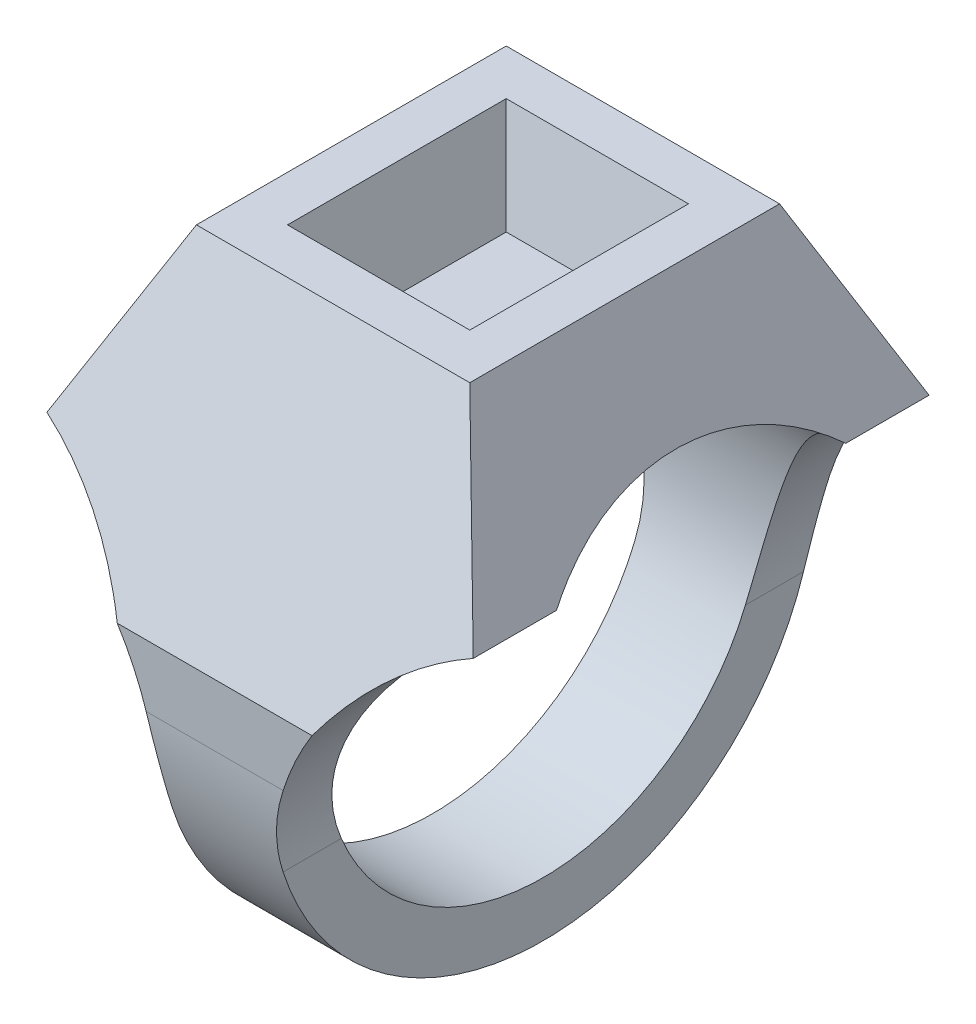
ISO-10303-21;
HEADER;
FILE_DESCRIPTION(('STEP AP214'),'2;1');
FILE_NAME('part.step','',(''),(''),'','','');
FILE_SCHEMA(('AUTOMOTIVE_DESIGN { 1 0 10303 214 1 1 1 1 }'));
ENDSEC;
DATA;
#1=APPLICATION_CONTEXT('core data for automotive mechanical design processes');
#2=APPLICATION_PROTOCOL_DEFINITION('international standard','automotive_design',2000,#1);
#3=PRODUCT_CONTEXT('',#1,'mechanical');
#4=PRODUCT('Part','Part','',(#3));
#5=PRODUCT_RELATED_PRODUCT_CATEGORY('part','',(#4));
#6=PRODUCT_DEFINITION_FORMATION('','',#4);
#7=PRODUCT_DEFINITION_CONTEXT('part definition',#1,'design');
#8=PRODUCT_DEFINITION('design','',#6,#7);
#9=PRODUCT_DEFINITION_SHAPE('','',#8);
#10=(LENGTH_UNIT() NAMED_UNIT(*) SI_UNIT(.MILLI.,.METRE.));
#11=(NAMED_UNIT(*) PLANE_ANGLE_UNIT() SI_UNIT($,.RADIAN.));
#12=(NAMED_UNIT(*) SI_UNIT($,.STERADIAN.) SOLID_ANGLE_UNIT());
#13=UNCERTAINTY_MEASURE_WITH_UNIT(LENGTH_MEASURE(1.E-05),#10,'distance_accuracy_value','');
#14=(GEOMETRIC_REPRESENTATION_CONTEXT(3) GLOBAL_UNCERTAINTY_ASSIGNED_CONTEXT((#13)) GLOBAL_UNIT_ASSIGNED_CONTEXT((#10,
#11,#12)) REPRESENTATION_CONTEXT('',''));
#15=CARTESIAN_POINT('',(0.,0.,0.));
#16=DIRECTION('',(0.,0.,1.));
#17=DIRECTION('',(1.,0.,0.));
#18=AXIS2_PLACEMENT_3D('',#15,#16,#17);
#19=CARTESIAN_POINT('',(25.,0.,0.));
#20=DIRECTION('',(-1.,0.,0.));
#21=DIRECTION('',(0.,0.,1.));
#22=AXIS2_PLACEMENT_3D('',#19,#20,#21);
#23=CYLINDRICAL_SURFACE('',#22,12.);
#24=CARTESIAN_POINT('',(11.696768923395,9.00000000000001,7.93725393319377));
#25=CARTESIAN_POINT('',(11.4898922507499,8.90351609964056,8.04667349740066));
#26=CARTESIAN_POINT('',(11.2856632608987,8.80254830553338,8.15712207840189));
#27=CARTESIAN_POINT('',(10.8824078082062,8.59164106073572,8.37896501460795));
#28=CARTESIAN_POINT('',(10.683381489789,8.48170136133743,8.49035939595431));
#29=CARTESIAN_POINT('',(10.2901048566922,8.25265076780511,8.71317102583135));
#30=CARTESIAN_POINT('',(10.0958635466891,8.13352410114215,8.82458797073825));
#31=CARTESIAN_POINT('',(9.71256268223377,7.88623633042385,9.04626191735328));
#32=CARTESIAN_POINT('',(9.52350308689503,7.75807529768293,9.15651892820967));
#33=CARTESIAN_POINT('',(8.9601721737352,7.35706413653597,9.48653155989749));
#34=CARTESIAN_POINT('',(8.5939280432559,7.07011290633731,9.70312298997915));
#35=CARTESIAN_POINT('',(7.8849565777725,6.45863032678025,10.1204263028944));
#36=CARTESIAN_POINT('',(7.54220931293983,6.1341314690592,10.3211516658616));
#37=CARTESIAN_POINT('',(6.98814625535127,5.5566945729337,10.6392918166008));
#38=CARTESIAN_POINT('',(6.76975468591393,5.31390732928115,10.7628707384123));
#39=CARTESIAN_POINT('',(6.34647349150372,4.81080752831703,10.9969580536258));
#40=CARTESIAN_POINT('',(6.14158358476757,4.55049533695912,11.1074667198264));
#41=CARTESIAN_POINT('',(5.74765796408806,4.01386366385306,11.3124297164592));
#42=CARTESIAN_POINT('',(5.55856199547818,3.73761252408568,11.4069466200406));
#43=CARTESIAN_POINT('',(5.19706007980886,3.16901263696019,11.5777989496208));
#44=CARTESIAN_POINT('',(5.02465114122809,2.8766667897338,11.6541376380658));
#45=CARTESIAN_POINT('',(4.72562423173207,2.3273458547535,11.7749227916433));
#46=CARTESIAN_POINT('',(4.5961673635325,2.0726164573523,11.8225661840739));
#47=CARTESIAN_POINT('',(4.35119713386637,1.55413603286753,11.9018235106766));
#48=CARTESIAN_POINT('',(4.23568105507132,1.29038677683287,11.9334405725468));
#49=CARTESIAN_POINT('',(4.01951236535601,0.755169507030311,11.9792276078791));
#50=CARTESIAN_POINT('',(3.91886902299318,0.483696804681932,11.9933867417354));
#51=CARTESIAN_POINT('',(3.73339102333747,-0.064938436597976,12.002959676648));
#52=CARTESIAN_POINT('',(3.64855592366956,-0.342100816069565,11.9983740023382));
#53=CARTESIAN_POINT('',(3.49491881390242,-0.901349641031113,11.9693925370385));
#54=CARTESIAN_POINT('',(3.42620037475787,-1.18345393992003,11.9448963067047));
#55=CARTESIAN_POINT('',(3.30563953723561,-1.74878541220327,11.8753046240213));
#56=CARTESIAN_POINT('',(3.25379973790869,-2.03201275173858,11.8302060017873));
#57=CARTESIAN_POINT('',(3.16698356966412,-2.5964899279227,11.7192518071775));
#58=CARTESIAN_POINT('',(3.1319805745176,-2.87774218918747,11.6534292828156));
#59=CARTESIAN_POINT('',(3.0782259930045,-3.43604801080039,11.5011826421243));
#60=CARTESIAN_POINT('',(3.05946421607349,-3.7131040966517,11.4147714876195));
#61=CARTESIAN_POINT('',(3.04420929684909,-4.08919489553572,11.282299877384));
#62=CARTESIAN_POINT('',(3.04112833424835,-4.19109177333682,11.2448453885665));
#63=CARTESIAN_POINT('',(3.03704686969024,-4.3937137718804,11.1672297899866));
#64=CARTESIAN_POINT('',(3.03604320696529,-4.49444044059509,11.12707288843));
#65=CARTESIAN_POINT('',(3.03604284950542,-4.59461680554976,11.0855535003968));
#66=B_SPLINE_CURVE_WITH_KNOTS('',3,(#24,#25,#26,#27,#28,#29,#30,#31,#32,#33,#34,#35,#36,#37,#38,
#39,#40,#41,#42,#43,#44,#45,#46,#47,#48,#49,#50,#51,#52,#53,#54,#55,#56,#57,#58,#59,#60,#61,#62,
#63,#64,#65),.UNSPECIFIED.,.F.,.F.,(4,2,2,2,2,2,2,2,2,2,2,2,2,2,2,2,2,2,2,2,4),(0.,
0.759348586630302,1.51871823011696,2.27942192433916,3.04011961448058,4.57765959936899,
6.11387889479053,7.16052804714838,8.20715535029017,9.24958759251021,10.2918326080692,
11.1600331862337,12.028064261107,12.8966340244342,13.7651794782093,14.638133727822,
15.5112223354521,16.3829256376171,17.2540815916275,17.5798547939013,17.9051319423045),.UNSPECIFIED.);
#67=CARTESIAN_POINT('',(11.696768923395,9.00000000000001,7.93725393319376));
#68=VERTEX_POINT('',#67);
#69=CARTESIAN_POINT('',(3.03604284950542,-4.59461680554976,11.0855535003968));
#70=VERTEX_POINT('',#69);
#71=EDGE_CURVE('E313',#68,#70,#66,.T.);
#72=ORIENTED_EDGE('',*,*,#71,.T.);
#73=CARTESIAN_POINT('',(3.03604284950542,0.,0.));
#74=DIRECTION('',(1.,0.,0.));
#75=DIRECTION('',(0.,0.,-1.));
#76=AXIS2_PLACEMENT_3D('',#73,#74,#75);
#77=CIRCLE('',#76,12.);
#78=CARTESIAN_POINT('',(3.03604284950542,-4.59461680554976,-11.0855535003968));
#79=VERTEX_POINT('',#78);
#80=EDGE_CURVE('E329',#70,#79,#77,.T.);
#81=ORIENTED_EDGE('',*,*,#80,.T.);
#82=CARTESIAN_POINT('',(3.03604284950542,-4.59461680554976,-11.0855535003968));
#83=CARTESIAN_POINT('',(3.036041789301,-4.46706348438094,-11.138421419146));
#84=CARTESIAN_POINT('',(3.03767035833519,-4.33861036349681,-11.1890798636254));
#85=CARTESIAN_POINT('',(3.0443118772741,-4.08010767040448,-11.2859103847761));
#86=CARTESIAN_POINT('',(3.04932490540121,-3.95005806136609,-11.3320823577269));
#87=CARTESIAN_POINT('',(3.06962580801962,-3.55787556145178,-11.4637480042315));
#88=CARTESIAN_POINT('',(3.0901754098747,-3.29366259483693,-11.542410625838));
#89=CARTESIAN_POINT('',(3.14590641440269,-2.76302033783825,-11.6807802152518));
#90=CARTESIAN_POINT('',(3.1810284158462,-2.49660430006689,-11.7405624222479));
#91=CARTESIAN_POINT('',(3.26627957514473,-1.96266675756447,-11.8415261544587));
#92=CARTESIAN_POINT('',(3.31640740910512,-1.69514535240735,-11.8827093197763));
#93=CARTESIAN_POINT('',(3.43178461738038,-1.16090106994587,-11.9467472187745));
#94=CARTESIAN_POINT('',(3.49704893360426,-0.894179247213834,-11.9695837415583));
#95=CARTESIAN_POINT('',(3.6424216924295,-0.363863719348178,-11.9974212423297));
#96=CARTESIAN_POINT('',(3.72253115589915,-0.100270230670516,-12.0024209932422));
#97=CARTESIAN_POINT('',(3.89708511165548,0.421924236239038,-11.9954234663236));
#98=CARTESIAN_POINT('',(3.99153197231492,0.68052438165809,-11.9834233775811));
#99=CARTESIAN_POINT('',(4.19402826172605,1.19106012761191,-11.9434897418651));
#100=CARTESIAN_POINT('',(4.30207785517391,1.44299564740949,-11.9155560019593));
#101=CARTESIAN_POINT('',(4.53316925707393,1.94372608059834,-11.8442870165842));
#102=CARTESIAN_POINT('',(4.65646342508172,2.19236262977887,-11.8006606054012));
#103=CARTESIAN_POINT('',(4.91532559810576,2.68020578067013,-11.6995112468579));
#104=CARTESIAN_POINT('',(5.0508935485062,2.91941242433522,-11.6419883613321));
#105=CARTESIAN_POINT('',(5.33340846483162,3.38773319804166,-11.5144343788272));
#106=CARTESIAN_POINT('',(5.4803622589175,3.61684114059431,-11.4443957426687));
#107=CARTESIAN_POINT('',(5.78464694060675,4.06428255226334,-11.2932457098966));
#108=CARTESIAN_POINT('',(5.94198005696048,4.28261368956694,-11.2121319310931));
#109=CARTESIAN_POINT('',(6.35294688322988,4.82206411246525,-10.9941715341438));
#110=CARTESIAN_POINT('',(6.61304417740289,5.13563863381522,-10.8507352285186));
#111=CARTESIAN_POINT('',(7.15291708165342,5.73595556999455,-10.545723346538));
#112=CARTESIAN_POINT('',(7.43270243804255,6.0226845292694,-10.3841387621902));
#113=CARTESIAN_POINT('',(8.01023109341833,6.56968146369542,-10.0470217260895));
#114=CARTESIAN_POINT('',(8.30800462923527,6.82990279194785,-9.87146562264844));
#115=CARTESIAN_POINT('',(8.91942184260403,7.32350309212359,-9.5110291057263));
#116=CARTESIAN_POINT('',(9.23306034645477,7.55689073451035,-9.32615173205412));
#117=CARTESIAN_POINT('',(9.89536247139068,8.01095289546064,-8.93973325502395));
#118=CARTESIAN_POINT('',(10.2449924640223,8.22994684789052,-8.73786895108222));
#119=CARTESIAN_POINT('',(10.7810470594009,8.53576963673854,-8.43570141780814));
#120=CARTESIAN_POINT('',(10.9611895305723,8.63370985870978,-8.33534063649873));
#121=CARTESIAN_POINT('',(11.3257512458851,8.82231463455356,-8.13545803656732));
#122=CARTESIAN_POINT('',(11.5101712874384,8.91297781758099,-8.03593637916445));
#123=CARTESIAN_POINT('',(11.696768923395,9.00000000000001,-7.93725393319377));
#124=B_SPLINE_CURVE_WITH_KNOTS('',3,(#82,#83,#84,#85,#86,#87,#88,#89,#90,#91,#92,#93,#94,#95,
#96,#97,#98,#99,#100,#101,#102,#103,#104,#105,#106,#107,#108,#109,#110,#111,#112,#113,#114,#115,
#116,#117,#118,#119,#120,#121,#122,#123),.UNSPECIFIED.,.F.,.F.,(4,2,2,2,2,2,2,2,2,2,2,2,2,2,2,2,
2,2,2,2,4),(0.,0.414165407508414,0.828340387630296,1.65654016329892,2.48139662267758,
3.3061803302539,4.13178171100707,4.95743988764457,5.78323460221001,6.60903931611264,
7.45103137420718,8.29301968579328,9.13551691064011,9.97819563737871,11.2719945577453,
12.5664385238796,13.8631224082928,15.1593861254669,16.5358690414418,17.2206028657483,
17.9054653786171),.UNSPECIFIED.);
#125=CARTESIAN_POINT('',(11.696768923395,9.00000000000001,-7.93725393319377));
#126=VERTEX_POINT('',#125);
#127=EDGE_CURVE('E321',#79,#126,#124,.T.);
#128=ORIENTED_EDGE('',*,*,#127,.T.);
#129=CARTESIAN_POINT('',(15.8935378467899,0.,0.));
#130=DIRECTION('',(0.906307787036651,0.422618261740698,0.));
#131=DIRECTION('',(-0.422618261740698,0.906307787036651,0.));
#132=AXIS2_PLACEMENT_3D('',#129,#130,#131);
#133=ELLIPSE('',#132,13.2405350275499,12.);
#134=EDGE_CURVE('E401',#126,#68,#133,.T.);
#135=ORIENTED_EDGE('',*,*,#134,.T.);
#136=EDGE_LOOP('',(#72,#81,#128,#135));
#137=FACE_BOUND('',#136,.T.);
#138=CARTESIAN_POINT('',(-11.696768923395,9.00000000000001,-7.93725393319377));
#139=CARTESIAN_POINT('',(-11.4898922507499,8.90351609964057,-8.04667349740066));
#140=CARTESIAN_POINT('',(-11.2856632608987,8.80254830553338,-8.15712207840189));
#141=CARTESIAN_POINT('',(-10.8824078082062,8.59164106073572,-8.37896501460795));
#142=CARTESIAN_POINT('',(-10.683381489789,8.48170136133743,-8.49035939595431));
#143=CARTESIAN_POINT('',(-10.2901048566922,8.25265076780511,-8.71317102583135));
#144=CARTESIAN_POINT('',(-10.0958635466891,8.13352410114215,-8.82458797073825));
#145=CARTESIAN_POINT('',(-9.71256268223377,7.88623633042386,-9.04626191735328));
#146=CARTESIAN_POINT('',(-9.52350308689504,7.75807529768294,-9.15651892820967));
#147=CARTESIAN_POINT('',(-8.9601721737352,7.35706413653597,-9.48653155989749));
#148=CARTESIAN_POINT('',(-8.5939280432559,7.07011290633732,-9.70312298997915));
#149=CARTESIAN_POINT('',(-7.8849565777725,6.45863032678025,-10.1204263028944));
#150=CARTESIAN_POINT('',(-7.54220931293983,6.1341314690592,-10.3211516658616));
#151=CARTESIAN_POINT('',(-6.98814625535127,5.5566945729337,-10.6392918166008));
#152=CARTESIAN_POINT('',(-6.76975468591393,5.31390732928115,-10.7628707384123));
#153=CARTESIAN_POINT('',(-6.34647349150372,4.81080752831703,-10.9969580536258));
#154=CARTESIAN_POINT('',(-6.14158358476757,4.55049533695912,-11.1074667198264));
#155=CARTESIAN_POINT('',(-5.74765796408806,4.01386366385306,-11.3124297164592));
#156=CARTESIAN_POINT('',(-5.55856199547818,3.73761252408568,-11.4069466200406));
#157=CARTESIAN_POINT('',(-5.19706007980886,3.16901263696019,-11.5777989496208));
#158=CARTESIAN_POINT('',(-5.02465114122809,2.8766667897338,-11.6541376380658));
#159=CARTESIAN_POINT('',(-4.72562423173207,2.3273458547535,-11.7749227916433));
#160=CARTESIAN_POINT('',(-4.5961673635325,2.07261645735229,-11.8225661840739));
#161=CARTESIAN_POINT('',(-4.35119713386637,1.55413603286753,-11.9018235106766));
#162=CARTESIAN_POINT('',(-4.23568105507132,1.29038677683287,-11.9334405725468));
#163=CARTESIAN_POINT('',(-4.01951236535601,0.755169507030311,-11.9792276078791));
#164=CARTESIAN_POINT('',(-3.91886902299318,0.483696804681931,-11.9933867417354));
#165=CARTESIAN_POINT('',(-3.73339102333747,-0.0649384365979764,-12.002959676648));
#166=CARTESIAN_POINT('',(-3.64855592366956,-0.342100816069565,-11.9983740023382));
#167=CARTESIAN_POINT('',(-3.49491881390242,-0.901349641031113,-11.9693925370385));
#168=CARTESIAN_POINT('',(-3.42620037475787,-1.18345393992003,-11.9448963067047));
#169=CARTESIAN_POINT('',(-3.30563953723561,-1.74878541220327,-11.8753046240213));
#170=CARTESIAN_POINT('',(-3.25379973790868,-2.03201275173858,-11.8302060017873));
#171=CARTESIAN_POINT('',(-3.16698356966412,-2.5964899279227,-11.7192518071775));
#172=CARTESIAN_POINT('',(-3.1319805745176,-2.87774218918747,-11.6534292828156));
#173=CARTESIAN_POINT('',(-3.0782259930045,-3.43604801080039,-11.5011826421243));
#174=CARTESIAN_POINT('',(-3.05946421607348,-3.71310409665171,-11.4147714876195));
#175=CARTESIAN_POINT('',(-3.04420929684909,-4.08919489553573,-11.282299877384));
#176=CARTESIAN_POINT('',(-3.04112833424835,-4.19109177333682,-11.2448453885665));
#177=CARTESIAN_POINT('',(-3.03704686969024,-4.3937137718804,-11.1672297899866));
#178=CARTESIAN_POINT('',(-3.03604320696529,-4.49444044059509,-11.12707288843));
#179=CARTESIAN_POINT('',(-3.03604284950542,-4.59461680554976,-11.0855535003968));
#180=B_SPLINE_CURVE_WITH_KNOTS('',3,(#138,#139,#140,#141,#142,#143,#144,#145,#146,#147,#148,
#149,#150,#151,#152,#153,#154,#155,#156,#157,#158,#159,#160,#161,#162,#163,#164,#165,#166,#167,
#168,#169,#170,#171,#172,#173,#174,#175,#176,#177,#178,#179),.UNSPECIFIED.,.F.,.F.,(4,2,2,2,2,2,
2,2,2,2,2,2,2,2,2,2,2,2,2,2,4),(0.,0.759348586630302,1.51871823011696,2.27942192433916,
3.04011961448058,4.57765959936899,6.11387889479053,7.16052804714838,8.20715535029017,
9.24958759251021,10.2918326080692,11.1600331862338,12.028064261107,12.8966340244342,
13.7651794782093,14.638133727822,15.5112223354521,16.3829256376171,17.2540815916275,
17.5798547939013,17.9051319423045),.UNSPECIFIED.);
#181=CARTESIAN_POINT('',(-11.696768923395,9.00000000000001,-7.93725393319377));
#182=VERTEX_POINT('',#181);
#183=CARTESIAN_POINT('',(-3.03604284950542,-4.59461680554976,-11.0855535003968));
#184=VERTEX_POINT('',#183);
#185=EDGE_CURVE('E55',#182,#184,#180,.T.);
#186=ORIENTED_EDGE('',*,*,#185,.T.);
#187=CARTESIAN_POINT('',(-3.03604284950542,0.,0.));
#188=DIRECTION('',(-1.,0.,0.));
#189=DIRECTION('',(0.,0.,1.));
#190=AXIS2_PLACEMENT_3D('',#187,#188,#189);
#191=CIRCLE('',#190,12.);
#192=CARTESIAN_POINT('',(-3.03604284950542,-4.59461680554976,11.0855535003968));
#193=VERTEX_POINT('',#192);
#194=EDGE_CURVE('E12',#184,#193,#191,.T.);
#195=ORIENTED_EDGE('',*,*,#194,.T.);
#196=CARTESIAN_POINT('',(-3.03604284950542,-4.59461680554976,11.0855535003968));
#197=CARTESIAN_POINT('',(-3.036041789301,-4.46706348438094,11.138421419146));
#198=CARTESIAN_POINT('',(-3.03767035833519,-4.33861036349681,11.1890798636254));
#199=CARTESIAN_POINT('',(-3.0443118772741,-4.08010767040448,11.2859103847761));
#200=CARTESIAN_POINT('',(-3.04932490540121,-3.95005806136609,11.3320823577269));
#201=CARTESIAN_POINT('',(-3.06962580801962,-3.55787556145178,11.4637480042315));
#202=CARTESIAN_POINT('',(-3.0901754098747,-3.29366259483693,11.542410625838));
#203=CARTESIAN_POINT('',(-3.14590641440269,-2.76302033783825,11.6807802152518));
#204=CARTESIAN_POINT('',(-3.1810284158462,-2.49660430006689,11.7405624222479));
#205=CARTESIAN_POINT('',(-3.26627957514473,-1.96266675756447,11.8415261544587));
#206=CARTESIAN_POINT('',(-3.31640740910512,-1.69514535240735,11.8827093197763));
#207=CARTESIAN_POINT('',(-3.43178461738038,-1.16090106994587,11.9467472187745));
#208=CARTESIAN_POINT('',(-3.49704893360426,-0.894179247213834,11.9695837415583));
#209=CARTESIAN_POINT('',(-3.6424216924295,-0.363863719348178,11.9974212423297));
#210=CARTESIAN_POINT('',(-3.72253115589915,-0.100270230670516,12.0024209932422));
#211=CARTESIAN_POINT('',(-3.89708511165548,0.421924236239038,11.9954234663236));
#212=CARTESIAN_POINT('',(-3.99153197231492,0.68052438165809,11.9834233775811));
#213=CARTESIAN_POINT('',(-4.19402826172605,1.19106012761191,11.9434897418651));
#214=CARTESIAN_POINT('',(-4.30207785517391,1.44299564740949,11.9155560019593));
#215=CARTESIAN_POINT('',(-4.53316925707393,1.94372608059834,11.8442870165842));
#216=CARTESIAN_POINT('',(-4.65646342508172,2.19236262977887,11.8006606054012));
#217=CARTESIAN_POINT('',(-4.91532559810576,2.68020578067013,11.6995112468579));
#218=CARTESIAN_POINT('',(-5.0508935485062,2.91941242433522,11.6419883613321));
#219=CARTESIAN_POINT('',(-5.33340846483162,3.38773319804166,11.5144343788272));
#220=CARTESIAN_POINT('',(-5.4803622589175,3.61684114059431,11.4443957426687));
#221=CARTESIAN_POINT('',(-5.78464694060675,4.06428255226334,11.2932457098966));
#222=CARTESIAN_POINT('',(-5.94198005696048,4.28261368956694,11.2121319310931));
#223=CARTESIAN_POINT('',(-6.35294688322988,4.82206411246525,10.9941715341438));
#224=CARTESIAN_POINT('',(-6.61304417740289,5.13563863381522,10.8507352285186));
#225=CARTESIAN_POINT('',(-7.15291708165342,5.73595556999455,10.545723346538));
#226=CARTESIAN_POINT('',(-7.43270243804255,6.0226845292694,10.3841387621902));
#227=CARTESIAN_POINT('',(-8.01023109341833,6.56968146369542,10.0470217260895));
#228=CARTESIAN_POINT('',(-8.30800462923526,6.82990279194786,9.87146562264844));
#229=CARTESIAN_POINT('',(-8.91942184260403,7.3235030921236,9.5110291057263));
#230=CARTESIAN_POINT('',(-9.23306034645477,7.55689073451035,9.32615173205412));
#231=CARTESIAN_POINT('',(-9.89536247139068,8.01095289546064,8.93973325502395));
#232=CARTESIAN_POINT('',(-10.2449924640223,8.22994684789052,8.73786895108222));
#233=CARTESIAN_POINT('',(-10.7810470594009,8.53576963673854,8.43570141780814));
#234=CARTESIAN_POINT('',(-10.9611895305723,8.63370985870978,8.33534063649873));
#235=CARTESIAN_POINT('',(-11.3257512458851,8.82231463455356,8.13545803656732));
#236=CARTESIAN_POINT('',(-11.5101712874384,8.91297781758099,8.03593637916445));
#237=CARTESIAN_POINT('',(-11.696768923395,9.00000000000001,7.93725393319377));
#238=B_SPLINE_CURVE_WITH_KNOTS('',3,(#196,#197,#198,#199,#200,#201,#202,#203,#204,#205,#206,
#207,#208,#209,#210,#211,#212,#213,#214,#215,#216,#217,#218,#219,#220,#221,#222,#223,#224,#225,
#226,#227,#228,#229,#230,#231,#232,#233,#234,#235,#236,#237),.UNSPECIFIED.,.F.,.F.,(4,2,2,2,2,2,
2,2,2,2,2,2,2,2,2,2,2,2,2,2,4),(0.,0.414165407508414,0.828340387630296,1.65654016329892,
2.48139662267758,3.3061803302539,4.13178171100707,4.95743988764457,5.78323460221001,
6.60903931611264,7.45103137420718,8.29301968579328,9.13551691064011,9.97819563737871,
11.2719945577453,12.5664385238796,13.8631224082928,15.1593861254669,16.5358690414418,
17.2206028657483,17.9054653786171),.UNSPECIFIED.);
#239=CARTESIAN_POINT('',(-11.696768923395,9.00000000000001,7.93725393319376));
#240=VERTEX_POINT('',#239);
#241=EDGE_CURVE('E288',#193,#240,#238,.T.);
#242=ORIENTED_EDGE('',*,*,#241,.T.);
#243=CARTESIAN_POINT('',(-15.8935378467901,0.,0.));
#244=DIRECTION('',(-0.906307787036643,0.422618261740714,0.));
#245=DIRECTION('',(-0.422618261740714,-0.906307787036643,0.));
#246=AXIS2_PLACEMENT_3D('',#243,#244,#245);
#247=ELLIPSE('',#246,13.24053502755,12.);
#248=EDGE_CURVE('E332',#240,#182,#247,.T.);
#249=ORIENTED_EDGE('',*,*,#248,.T.);
#250=EDGE_LOOP('',(#186,#195,#242,#249));
#251=FACE_BOUND('',#250,.T.);
#252=ADVANCED_FACE('F46',(#137,#251),#23,.F.);
#253=CARTESIAN_POINT('',(3.03604284950542,-4.59461680554976,-15.));
#254=DIRECTION('',(1.,0.,0.));
#255=DIRECTION('',(0.,0.,-1.));
#256=AXIS2_PLACEMENT_3D('',#253,#254,#255);
#257=PLANE('',#256);
#258=CARTESIAN_POINT('',(3.03604284950542,0.,0.));
#259=DIRECTION('',(1.,0.,0.));
#260=DIRECTION('',(0.,0.,-1.));
#261=AXIS2_PLACEMENT_3D('',#258,#259,#260);
#262=CIRCLE('',#261,15.);
#263=CARTESIAN_POINT('',(3.03604284950542,-4.59461680554976,14.2789879336793));
#264=VERTEX_POINT('',#263);
#265=CARTESIAN_POINT('',(3.03604284950542,-4.59461680554976,-14.2789879336793));
#266=VERTEX_POINT('',#265);
#267=EDGE_CURVE('E350',#264,#266,#262,.T.);
#268=ORIENTED_EDGE('',*,*,#267,.T.);
#269=DIRECTION('',(0.,0.,1.));
#270=VECTOR('',#269,1.);
#271=CARTESIAN_POINT('',(3.03604284950542,-4.59461680554976,-15.));
#272=LINE('',#271,#270);
#273=EDGE_CURVE('E221',#266,#79,#272,.T.);
#274=ORIENTED_EDGE('',*,*,#273,.T.);
#275=ORIENTED_EDGE('',*,*,#80,.F.);
#276=EDGE_CURVE('E217',#70,#264,#272,.T.);
#277=ORIENTED_EDGE('',*,*,#276,.T.);
#278=EDGE_LOOP('',(#268,#274,#275,#277));
#279=FACE_BOUND('',#278,.T.);
#280=ADVANCED_FACE('F305',(#279),#257,.T.);
#281=CARTESIAN_POINT('',(7.5,18.,-15.));
#282=DIRECTION('',(0.906307787036651,0.422618261740698,0.));
#283=DIRECTION('',(-0.422618261740698,0.906307787036651,0.));
#284=AXIS2_PLACEMENT_3D('',#281,#282,#283);
#285=PLANE('',#284);
#286=DIRECTION('',(-0.391914486291179,0.840463328099387,0.374198382619732));
#287=VECTOR('',#286,1.);
#288=CARTESIAN_POINT('',(10.1879468798854,12.2356793141237,-11.0664409206695));
#289=LINE('',#288,#287);
#290=CARTESIAN_POINT('',(11.696768923395,9.00000000000001,-12.5070581677769));
#291=VERTEX_POINT('',#290);
#292=CARTESIAN_POINT('',(7.5,18.,-8.5));
#293=VERTEX_POINT('',#292);
#294=EDGE_CURVE('E246',#291,#293,#289,.T.);
#295=ORIENTED_EDGE('',*,*,#294,.T.);
#296=DIRECTION('',(0.,0.,1.));
#297=VECTOR('',#296,1.);
#298=CARTESIAN_POINT('',(7.5,18.,-15.));
#299=LINE('',#298,#297);
#300=CARTESIAN_POINT('',(7.5,18.,8.5));
#301=VERTEX_POINT('',#300);
#302=EDGE_CURVE('E236',#293,#301,#299,.T.);
#303=ORIENTED_EDGE('',*,*,#302,.T.);
#304=DIRECTION('',(0.391914486291179,-0.840463328099387,0.374198382619732));
#305=VECTOR('',#304,1.);
#306=CARTESIAN_POINT('',(10.1879468798854,12.2356793141237,11.0664409206695));
#307=LINE('',#306,#305);
#308=CARTESIAN_POINT('',(11.696768923395,9.00000000000001,12.5070581677769));
#309=VERTEX_POINT('',#308);
#310=EDGE_CURVE('E243',#301,#309,#307,.T.);
#311=ORIENTED_EDGE('',*,*,#310,.T.);
#312=DIRECTION('',(0.,0.,1.));
#313=VECTOR('',#312,1.);
#314=CARTESIAN_POINT('',(11.696768923395,9.00000000000001,-15.));
#315=LINE('',#314,#313);
#316=EDGE_CURVE('E216',#68,#309,#315,.T.);
#317=ORIENTED_EDGE('',*,*,#316,.F.);
#318=ORIENTED_EDGE('',*,*,#134,.F.);
#319=EDGE_CURVE('E239',#291,#126,#315,.T.);
#320=ORIENTED_EDGE('',*,*,#319,.F.);
#321=EDGE_LOOP('',(#295,#303,#311,#317,#318,#320));
#322=FACE_BOUND('',#321,.T.);
#323=ADVANCED_FACE('F430',(#322),#285,.T.);
#324=CARTESIAN_POINT('',(18.0360428495054,-4.59461680554976,-15.));
#325=DIRECTION('',(0.,0.,1.));
#326=DIRECTION('',(1.,0.,0.));
#327=AXIS2_PLACEMENT_3D('',#324,#325,#326);
#328=CYLINDRICAL_SURFACE('',#327,15.);
#329=CARTESIAN_POINT('',(18.0360428495054,-4.59461680554976,18.5597715353852));
#330=DIRECTION('',(0.,-0.406736643075804,-0.913545457642599));
#331=DIRECTION('',(0.,-0.913545457642599,0.406736643075804));
#332=AXIS2_PLACEMENT_3D('',#329,#330,#331);
#333=ELLIPSE('',#332,16.4195441775907,15.);
#334=CARTESIAN_POINT('',(5.34455222656136,3.40076096962277,15.));
#335=VERTEX_POINT('',#334);
#336=EDGE_CURVE('E372',#309,#335,#333,.F.);
#337=ORIENTED_EDGE('',*,*,#336,.T.);
#338=CARTESIAN_POINT('',(18.0360428495054,-4.59461680554976,15.));
#339=DIRECTION('',(0.,0.,-1.));
#340=DIRECTION('',(1.,0.,0.));
#341=AXIS2_PLACEMENT_3D('',#338,#339,#340);
#342=CIRCLE('',#341,15.);
#343=CARTESIAN_POINT('',(3.7570549158261,0.,15.));
#344=VERTEX_POINT('',#343);
#345=EDGE_CURVE('E199',#344,#335,#342,.T.);
#346=ORIENTED_EDGE('',*,*,#345,.F.);
#347=CARTESIAN_POINT('',(3.7570549158261,0.,15.));
#348=CARTESIAN_POINT('',(3.70986535204939,-0.146649869451368,15.000001105202));
#349=CARTESIAN_POINT('',(3.66494327090934,-0.294011630943824,14.9978487104202));
#350=CARTESIAN_POINT('',(3.57968707451354,-0.589933433874308,14.9891258139098));
#351=CARTESIAN_POINT('',(3.53935316607944,-0.738493529006776,14.9825551131088));
#352=CARTESIAN_POINT('',(3.42529847718443,-1.18569467516777,14.9560443232608));
#353=CARTESIAN_POINT('',(3.35855062655661,-1.48577605394299,14.9293054239389));
#354=CARTESIAN_POINT('',(3.2449610669642,-2.08178744362935,14.8578145951888));
#355=CARTESIAN_POINT('',(3.1977801547342,-2.37769398877123,14.8133982966854));
#356=CARTESIAN_POINT('',(3.12148650147743,-2.96839519339179,14.706414212124));
#357=CARTESIAN_POINT('',(3.09236222778799,-3.2631904427999,14.6438580494396));
#358=CARTESIAN_POINT('',(3.05994585252327,-3.73033808012755,14.5298552756731));
#359=CARTESIAN_POINT('',(3.05096568446892,-3.90375906740776,14.4842267701249));
#360=CARTESIAN_POINT('',(3.03899568688527,-4.2499930422101,14.3864560716639));
#361=CARTESIAN_POINT('',(3.03603897320173,-4.4227974821155,14.3342795351105));
#362=CARTESIAN_POINT('',(3.03604284950542,-4.59461680554976,14.2789879336793));
#363=B_SPLINE_CURVE_WITH_KNOTS('',3,(#347,#348,#349,#350,#351,#352,#353,#354,#355,#356,#357,
#358,#359,#360,#361,#362),.UNSPECIFIED.,.F.,.F.,(4,2,2,2,2,2,2,4),(0.,0.462097096824936,
0.924215015413382,1.84870381350426,2.75641869003593,3.66355321586226,4.20200107272341,
4.74340131401869),.UNSPECIFIED.);
#364=EDGE_CURVE('E365',#344,#264,#363,.T.);
#365=ORIENTED_EDGE('',*,*,#364,.T.);
#366=ORIENTED_EDGE('',*,*,#276,.F.);
#367=ORIENTED_EDGE('',*,*,#71,.F.);
#368=ORIENTED_EDGE('',*,*,#316,.T.);
#369=EDGE_LOOP('',(#337,#346,#365,#366,#367,#368));
#370=FACE_BOUND('',#369,.T.);
#371=ADVANCED_FACE('F409',(#370),#328,.F.);
#372=CARTESIAN_POINT('',(18.0360428495054,-4.59461680554976,-18.5597715353852));
#373=DIRECTION('',(0.,-0.406736643075804,0.913545457642599));
#374=DIRECTION('',(0.,0.913545457642599,0.406736643075804));
#375=AXIS2_PLACEMENT_3D('',#372,#373,#374);
#376=ELLIPSE('',#375,16.4195441775907,15.);
#377=CARTESIAN_POINT('',(5.34455222656136,3.40076096962277,-15.));
#378=VERTEX_POINT('',#377);
#379=EDGE_CURVE('E375',#378,#291,#376,.F.);
#380=ORIENTED_EDGE('',*,*,#379,.T.);
#381=ORIENTED_EDGE('',*,*,#319,.T.);
#382=ORIENTED_EDGE('',*,*,#127,.F.);
#383=ORIENTED_EDGE('',*,*,#273,.F.);
#384=CARTESIAN_POINT('',(3.03604284950542,-4.59461680554976,-14.2789879336793));
#385=CARTESIAN_POINT('',(3.03604174430346,-4.44796693609839,-14.326177497456));
#386=CARTESIAN_POINT('',(3.03819413908522,-4.30060517460594,-14.3710995785961));
#387=CARTESIAN_POINT('',(3.04691703559563,-4.00468337167545,-14.4563557749919));
#388=CARTESIAN_POINT('',(3.05348773639662,-3.85612327654298,-14.496689683426));
#389=CARTESIAN_POINT('',(3.07999852624463,-3.40892213038198,-14.610744372321));
#390=CARTESIAN_POINT('',(3.10673742556648,-3.10884075160677,-14.6774922229488));
#391=CARTESIAN_POINT('',(3.17822825431666,-2.5128293619204,-14.7910817825412));
#392=CARTESIAN_POINT('',(3.22264455282001,-2.21692281677853,-14.8382626947712));
#393=CARTESIAN_POINT('',(3.32962863738144,-1.62622161215797,-14.914556348028));
#394=CARTESIAN_POINT('',(3.3921848000658,-1.33142636274986,-14.9436806217174));
#395=CARTESIAN_POINT('',(3.50618757383234,-0.86427872542221,-14.9760969969822));
#396=CARTESIAN_POINT('',(3.55181607938055,-0.690857738142002,-14.9850771650365));
#397=CARTESIAN_POINT('',(3.64958677784154,-0.344623763339652,-14.9970471626201));
#398=CARTESIAN_POINT('',(3.70176331439495,-0.171819323434257,-15.0000038763037));
#399=CARTESIAN_POINT('',(3.7570549158261,0.,-15.));
#400=B_SPLINE_CURVE_WITH_KNOTS('',3,(#384,#385,#386,#387,#388,#389,#390,#391,#392,#393,#394,
#395,#396,#397,#398,#399),.UNSPECIFIED.,.F.,.F.,(4,2,2,2,2,2,2,4),(0.,0.462097096824934,
0.924215015413381,1.84870381350426,2.75641869003593,3.66355321586226,4.20200107272341,
4.7434013140187),.UNSPECIFIED.);
#401=CARTESIAN_POINT('',(3.7570549158261,0.,-15.));
#402=VERTEX_POINT('',#401);
#403=EDGE_CURVE('E70',#266,#402,#400,.T.);
#404=ORIENTED_EDGE('',*,*,#403,.T.);
#405=CARTESIAN_POINT('',(18.0360428495054,-4.59461680554976,-15.));
#406=DIRECTION('',(0.,0.,-1.));
#407=DIRECTION('',(1.,0.,0.));
#408=AXIS2_PLACEMENT_3D('',#405,#406,#407);
#409=CIRCLE('',#408,15.);
#410=EDGE_CURVE('E210',#402,#378,#409,.T.);
#411=ORIENTED_EDGE('',*,*,#410,.T.);
#412=EDGE_LOOP('',(#380,#381,#382,#383,#404,#411));
#413=FACE_BOUND('',#412,.T.);
#414=ADVANCED_FACE('F307',(#413),#328,.F.);
#415=CARTESIAN_POINT('',(-3.03604284950542,-4.59461680554976,-15.));
#416=DIRECTION('',(-1.,0.,0.));
#417=DIRECTION('',(0.,0.,1.));
#418=AXIS2_PLACEMENT_3D('',#415,#416,#417);
#419=PLANE('',#418);
#420=CARTESIAN_POINT('',(-3.03604284950542,0.,0.));
#421=DIRECTION('',(-1.,0.,0.));
#422=DIRECTION('',(0.,0.,1.));
#423=AXIS2_PLACEMENT_3D('',#420,#421,#422);
#424=CIRCLE('',#423,15.);
#425=CARTESIAN_POINT('',(-3.03604284950542,-4.59461680554976,-14.2789879336793));
#426=VERTEX_POINT('',#425);
#427=CARTESIAN_POINT('',(-3.03604284950542,-4.59461680554976,14.2789879336793));
#428=VERTEX_POINT('',#427);
#429=EDGE_CURVE('E346',#426,#428,#424,.T.);
#430=ORIENTED_EDGE('',*,*,#429,.T.);
#431=DIRECTION('',(0.,0.,1.));
#432=VECTOR('',#431,1.);
#433=CARTESIAN_POINT('',(-3.03604284950542,-4.59461680554976,-15.));
#434=LINE('',#433,#432);
#435=EDGE_CURVE('E223',#193,#428,#434,.T.);
#436=ORIENTED_EDGE('',*,*,#435,.F.);
#437=ORIENTED_EDGE('',*,*,#194,.F.);
#438=EDGE_CURVE('E222',#426,#184,#434,.T.);
#439=ORIENTED_EDGE('',*,*,#438,.F.);
#440=EDGE_LOOP('',(#430,#436,#437,#439));
#441=FACE_BOUND('',#440,.T.);
#442=ADVANCED_FACE('F280',(#441),#419,.T.);
#443=CARTESIAN_POINT('',(-18.0360428495054,-4.59461680554976,-15.));
#444=DIRECTION('',(0.,0.,1.));
#445=DIRECTION('',(1.,0.,0.));
#446=AXIS2_PLACEMENT_3D('',#443,#444,#445);
#447=CYLINDRICAL_SURFACE('',#446,15.);
#448=CARTESIAN_POINT('',(-18.0360428495054,-4.59461680554976,-18.5597715353852));
#449=DIRECTION('',(0.,-0.406736643075804,0.913545457642599));
#450=DIRECTION('',(0.,0.913545457642599,0.406736643075804));
#451=AXIS2_PLACEMENT_3D('',#448,#449,#450);
#452=ELLIPSE('',#451,16.4195441775907,15.);
#453=CARTESIAN_POINT('',(-11.696768923395,9.00000000000001,-12.5070581677769));
#454=VERTEX_POINT('',#453);
#455=CARTESIAN_POINT('',(-5.34455222656136,3.40076096962277,-15.));
#456=VERTEX_POINT('',#455);
#457=EDGE_CURVE('E351',#454,#456,#452,.F.);
#458=ORIENTED_EDGE('',*,*,#457,.T.);
#459=CARTESIAN_POINT('',(-18.0360428495054,-4.59461680554976,-15.));
#460=DIRECTION('',(0.,0.,-1.));
#461=DIRECTION('',(-1.,0.,0.));
#462=AXIS2_PLACEMENT_3D('',#459,#460,#461);
#463=CIRCLE('',#462,15.);
#464=CARTESIAN_POINT('',(-3.7570549158261,0.,-15.));
#465=VERTEX_POINT('',#464);
#466=EDGE_CURVE('E213',#456,#465,#463,.T.);
#467=ORIENTED_EDGE('',*,*,#466,.T.);
#468=CARTESIAN_POINT('',(-3.75705491582609,0.,-15.));
#469=CARTESIAN_POINT('',(-3.70986535204939,-0.146649869451366,-15.000001105202));
#470=CARTESIAN_POINT('',(-3.66494327090934,-0.294011630943822,-14.9978487104202));
#471=CARTESIAN_POINT('',(-3.57968707451354,-0.589933433874306,-14.9891258139098));
#472=CARTESIAN_POINT('',(-3.53935316607944,-0.738493529006774,-14.9825551131088));
#473=CARTESIAN_POINT('',(-3.42529847718443,-1.18569467516777,-14.9560443232608));
#474=CARTESIAN_POINT('',(-3.35855062655661,-1.48577605394298,-14.9293054239389));
#475=CARTESIAN_POINT('',(-3.2449610669642,-2.08178744362935,-14.8578145951888));
#476=CARTESIAN_POINT('',(-3.1977801547342,-2.37769398877123,-14.8133982966854));
#477=CARTESIAN_POINT('',(-3.12148650147743,-2.96839519339178,-14.706414212124));
#478=CARTESIAN_POINT('',(-3.09236222778799,-3.26319044279989,-14.6438580494396));
#479=CARTESIAN_POINT('',(-3.05994585252327,-3.73033808012755,-14.5298552756731));
#480=CARTESIAN_POINT('',(-3.05096568446892,-3.90375906740775,-14.4842267701249));
#481=CARTESIAN_POINT('',(-3.03899568688527,-4.2499930422101,-14.3864560716639));
#482=CARTESIAN_POINT('',(-3.03603897320173,-4.4227974821155,-14.3342795351105));
#483=CARTESIAN_POINT('',(-3.03604284950542,-4.59461680554976,-14.2789879336793));
#484=B_SPLINE_CURVE_WITH_KNOTS('',3,(#468,#469,#470,#471,#472,#473,#474,#475,#476,#477,#478,
#479,#480,#481,#482,#483),.UNSPECIFIED.,.F.,.F.,(4,2,2,2,2,2,2,4),(0.,0.462097096824935,
0.924215015413382,1.84870381350425,2.75641869003593,3.66355321586226,4.20200107272341,
4.7434013140187),.UNSPECIFIED.);
#485=EDGE_CURVE('E264',#465,#426,#484,.T.);
#486=ORIENTED_EDGE('',*,*,#485,.T.);
#487=ORIENTED_EDGE('',*,*,#438,.T.);
#488=ORIENTED_EDGE('',*,*,#185,.F.);
#489=DIRECTION('',(0.,0.,1.));
#490=VECTOR('',#489,1.);
#491=CARTESIAN_POINT('',(-11.696768923395,9.00000000000001,-15.));
#492=LINE('',#491,#490);
#493=EDGE_CURVE('E227',#454,#182,#492,.T.);
#494=ORIENTED_EDGE('',*,*,#493,.F.);
#495=EDGE_LOOP('',(#458,#467,#486,#487,#488,#494));
#496=FACE_BOUND('',#495,.T.);
#497=ADVANCED_FACE('F274',(#496),#447,.F.);
#498=CARTESIAN_POINT('',(-18.0360428495054,-4.59461680554976,18.5597715353852));
#499=DIRECTION('',(0.,-0.406736643075804,-0.913545457642599));
#500=DIRECTION('',(0.,-0.913545457642599,0.406736643075804));
#501=AXIS2_PLACEMENT_3D('',#498,#499,#500);
#502=ELLIPSE('',#501,16.4195441775907,15.);
#503=CARTESIAN_POINT('',(-5.34455222656136,3.40076096962277,15.));
#504=VERTEX_POINT('',#503);
#505=CARTESIAN_POINT('',(-11.696768923395,9.00000000000001,12.5070581677769));
#506=VERTEX_POINT('',#505);
#507=EDGE_CURVE('E356',#504,#506,#502,.F.);
#508=ORIENTED_EDGE('',*,*,#507,.T.);
#509=EDGE_CURVE('E228',#240,#506,#492,.T.);
#510=ORIENTED_EDGE('',*,*,#509,.F.);
#511=ORIENTED_EDGE('',*,*,#241,.F.);
#512=ORIENTED_EDGE('',*,*,#435,.T.);
#513=CARTESIAN_POINT('',(-3.03604284950542,-4.59461680554976,14.2789879336793));
#514=CARTESIAN_POINT('',(-3.03604174430346,-4.44796693609839,14.326177497456));
#515=CARTESIAN_POINT('',(-3.03819413908522,-4.30060517460594,14.3710995785961));
#516=CARTESIAN_POINT('',(-3.04691703559563,-4.00468337167545,14.4563557749919));
#517=CARTESIAN_POINT('',(-3.05348773639662,-3.85612327654298,14.496689683426));
#518=CARTESIAN_POINT('',(-3.07999852624463,-3.40892213038198,14.610744372321));
#519=CARTESIAN_POINT('',(-3.10673742556648,-3.10884075160677,14.6774922229488));
#520=CARTESIAN_POINT('',(-3.17822825431666,-2.5128293619204,14.7910817825412));
#521=CARTESIAN_POINT('',(-3.22264455282001,-2.21692281677853,14.8382626947712));
#522=CARTESIAN_POINT('',(-3.32962863738144,-1.62622161215797,14.914556348028));
#523=CARTESIAN_POINT('',(-3.3921848000658,-1.33142636274986,14.9436806217174));
#524=CARTESIAN_POINT('',(-3.50618757383234,-0.864278725422211,14.9760969969822));
#525=CARTESIAN_POINT('',(-3.55181607938055,-0.690857738142003,14.9850771650365));
#526=CARTESIAN_POINT('',(-3.64958677784154,-0.344623763339655,14.9970471626201));
#527=CARTESIAN_POINT('',(-3.70176331439495,-0.17181932343426,15.0000038763037));
#528=CARTESIAN_POINT('',(-3.7570549158261,0.,15.));
#529=B_SPLINE_CURVE_WITH_KNOTS('',3,(#513,#514,#515,#516,#517,#518,#519,#520,#521,#522,#523,
#524,#525,#526,#527,#528),.UNSPECIFIED.,.F.,.F.,(4,2,2,2,2,2,2,4),(0.,0.462097096824935,
0.924215015413382,1.84870381350425,2.75641869003593,3.66355321586226,4.20200107272341,
4.74340131401869),.UNSPECIFIED.);
#530=CARTESIAN_POINT('',(-3.7570549158261,0.,15.));
#531=VERTEX_POINT('',#530);
#532=EDGE_CURVE('E255',#428,#531,#529,.T.);
#533=ORIENTED_EDGE('',*,*,#532,.T.);
#534=CARTESIAN_POINT('',(-18.0360428495054,-4.59461680554976,15.));
#535=DIRECTION('',(0.,0.,-1.));
#536=DIRECTION('',(-1.,0.,0.));
#537=AXIS2_PLACEMENT_3D('',#534,#535,#536);
#538=CIRCLE('',#537,15.);
#539=EDGE_CURVE('E203',#504,#531,#538,.T.);
#540=ORIENTED_EDGE('',*,*,#539,.F.);
#541=EDGE_LOOP('',(#508,#510,#511,#512,#533,#540));
#542=FACE_BOUND('',#541,.T.);
#543=ADVANCED_FACE('F279',(#542),#447,.F.);
#544=CARTESIAN_POINT('',(-7.5,17.9999999999996,-15.));
#545=DIRECTION('',(-0.906307787036643,0.422618261740714,0.));
#546=DIRECTION('',(-0.422618261740714,-0.906307787036643,0.));
#547=AXIS2_PLACEMENT_3D('',#544,#545,#546);
#548=PLANE('',#547);
#549=DIRECTION('',(-0.391914486291195,-0.840463328099381,-0.374198382619729));
#550=VECTOR('',#549,1.);
#551=CARTESIAN_POINT('',(-2.50809865164086,28.7051669880563,-3.7337525758993));
#552=LINE('',#551,#550);
#553=CARTESIAN_POINT('',(-7.5,17.9999999999996,-8.5));
#554=VERTEX_POINT('',#553);
#555=EDGE_CURVE('E252',#554,#454,#552,.T.);
#556=ORIENTED_EDGE('',*,*,#555,.T.);
#557=ORIENTED_EDGE('',*,*,#493,.T.);
#558=ORIENTED_EDGE('',*,*,#248,.F.);
#559=ORIENTED_EDGE('',*,*,#509,.T.);
#560=DIRECTION('',(0.391914486291195,0.840463328099381,-0.374198382619729));
#561=VECTOR('',#560,1.);
#562=CARTESIAN_POINT('',(-2.50809865164086,28.7051669880563,3.7337525758993));
#563=LINE('',#562,#561);
#564=CARTESIAN_POINT('',(-7.5,17.9999999999996,8.5000000000001));
#565=VERTEX_POINT('',#564);
#566=EDGE_CURVE('E249',#506,#565,#563,.T.);
#567=ORIENTED_EDGE('',*,*,#566,.T.);
#568=DIRECTION('',(0.,0.,1.));
#569=VECTOR('',#568,1.);
#570=CARTESIAN_POINT('',(-7.5,17.9999999999996,-15.));
#571=LINE('',#570,#569);
#572=EDGE_CURVE('E232',#554,#565,#571,.T.);
#573=ORIENTED_EDGE('',*,*,#572,.F.);
#574=EDGE_LOOP('',(#556,#557,#558,#559,#567,#573));
#575=FACE_BOUND('',#574,.T.);
#576=ADVANCED_FACE('F283',(#575),#548,.T.);
#577=CARTESIAN_POINT('',(25.,18.,-8.5));
#578=DIRECTION('',(0.,-0.406736643075804,0.913545457642599));
#579=DIRECTION('',(0.,-0.913545457642599,-0.406736643075804));
#580=AXIS2_PLACEMENT_3D('',#577,#578,#579);
#581=PLANE('',#580);
#582=ORIENTED_EDGE('',*,*,#457,.F.);
#583=ORIENTED_EDGE('',*,*,#555,.F.);
#584=DIRECTION('',(-1.,0.,0.));
#585=VECTOR('',#584,1.);
#586=CARTESIAN_POINT('',(25.,18.,-8.5));
#587=LINE('',#586,#585);
#588=EDGE_CURVE('E398',#293,#554,#587,.T.);
#589=ORIENTED_EDGE('',*,*,#588,.F.);
#590=ORIENTED_EDGE('',*,*,#294,.F.);
#591=ORIENTED_EDGE('',*,*,#379,.F.);
#592=DIRECTION('',(-1.,0.,0.));
#593=VECTOR('',#592,1.);
#594=CARTESIAN_POINT('',(25.,3.40076096962277,-15.));
#595=LINE('',#594,#593);
#596=EDGE_CURVE('E378',#378,#456,#595,.T.);
#597=ORIENTED_EDGE('',*,*,#596,.T.);
#598=EDGE_LOOP('',(#582,#583,#589,#590,#591,#597));
#599=FACE_BOUND('',#598,.T.);
#600=ADVANCED_FACE('F48',(#599),#581,.F.);
#601=CARTESIAN_POINT('',(25.,18.,8.5));
#602=DIRECTION('',(0.,-1.,0.));
#603=DIRECTION('',(0.,0.,-1.));
#604=AXIS2_PLACEMENT_3D('',#601,#602,#603);
#605=PLANE('',#604);
#606=DIRECTION('',(-1.,0.,0.));
#607=VECTOR('',#606,1.);
#608=CARTESIAN_POINT('',(-5.,18.,-6.));
#609=LINE('',#608,#607);
#610=CARTESIAN_POINT('',(5.,18.,-6.));
#611=VERTEX_POINT('',#610);
#612=CARTESIAN_POINT('',(-5.,18.,-6.));
#613=VERTEX_POINT('',#612);
#614=EDGE_CURVE('E194',#611,#613,#609,.T.);
#615=ORIENTED_EDGE('',*,*,#614,.F.);
#616=DIRECTION('',(0.,0.,-1.));
#617=VECTOR('',#616,1.);
#618=CARTESIAN_POINT('',(5.,18.,6.));
#619=LINE('',#618,#617);
#620=CARTESIAN_POINT('',(5.,18.,6.));
#621=VERTEX_POINT('',#620);
#622=EDGE_CURVE('E62',#621,#611,#619,.T.);
#623=ORIENTED_EDGE('',*,*,#622,.F.);
#624=DIRECTION('',(1.,0.,0.));
#625=VECTOR('',#624,1.);
#626=CARTESIAN_POINT('',(-5.,18.,6.));
#627=LINE('',#626,#625);
#628=CARTESIAN_POINT('',(-5.,18.,6.));
#629=VERTEX_POINT('',#628);
#630=EDGE_CURVE('E177',#629,#621,#627,.T.);
#631=ORIENTED_EDGE('',*,*,#630,.F.);
#632=DIRECTION('',(0.,0.,1.));
#633=VECTOR('',#632,1.);
#634=CARTESIAN_POINT('',(-5.,18.,6.));
#635=LINE('',#634,#633);
#636=EDGE_CURVE('E188',#613,#629,#635,.T.);
#637=ORIENTED_EDGE('',*,*,#636,.F.);
#638=EDGE_LOOP('',(#615,#623,#631,#637));
#639=FACE_BOUND('',#638,.T.);
#640=ORIENTED_EDGE('',*,*,#572,.T.);
#641=DIRECTION('',(-1.,0.,0.));
#642=VECTOR('',#641,1.);
#643=CARTESIAN_POINT('',(25.,18.,8.5));
#644=LINE('',#643,#642);
#645=EDGE_CURVE('E394',#301,#565,#644,.T.);
#646=ORIENTED_EDGE('',*,*,#645,.F.);
#647=ORIENTED_EDGE('',*,*,#302,.F.);
#648=ORIENTED_EDGE('',*,*,#588,.T.);
#649=EDGE_LOOP('',(#640,#646,#647,#648));
#650=FACE_BOUND('',#649,.T.);
#651=ADVANCED_FACE('F196',(#639,#650),#605,.F.);
#652=CARTESIAN_POINT('',(25.,18.,8.5));
#653=DIRECTION('',(0.,-0.406736643075804,-0.913545457642599));
#654=DIRECTION('',(0.,0.913545457642599,-0.406736643075804));
#655=AXIS2_PLACEMENT_3D('',#652,#653,#654);
#656=PLANE('',#655);
#657=ORIENTED_EDGE('',*,*,#507,.F.);
#658=DIRECTION('',(-1.,0.,0.));
#659=VECTOR('',#658,1.);
#660=CARTESIAN_POINT('',(25.,3.40076096962277,15.));
#661=LINE('',#660,#659);
#662=EDGE_CURVE('E390',#335,#504,#661,.T.);
#663=ORIENTED_EDGE('',*,*,#662,.F.);
#664=ORIENTED_EDGE('',*,*,#336,.F.);
#665=ORIENTED_EDGE('',*,*,#310,.F.);
#666=ORIENTED_EDGE('',*,*,#645,.T.);
#667=ORIENTED_EDGE('',*,*,#566,.F.);
#668=EDGE_LOOP('',(#657,#663,#664,#665,#666,#667));
#669=FACE_BOUND('',#668,.T.);
#670=ADVANCED_FACE('F436',(#669),#656,.F.);
#671=CARTESIAN_POINT('',(25.,0.,0.));
#672=DIRECTION('',(-1.,0.,0.));
#673=DIRECTION('',(0.,0.,1.));
#674=AXIS2_PLACEMENT_3D('',#671,#672,#673);
#675=CYLINDRICAL_SURFACE('',#674,15.);
#676=ORIENTED_EDGE('',*,*,#403,.F.);
#677=ORIENTED_EDGE('',*,*,#267,.F.);
#678=ORIENTED_EDGE('',*,*,#364,.F.);
#679=DIRECTION('',(-1.,0.,0.));
#680=VECTOR('',#679,1.);
#681=CARTESIAN_POINT('',(25.,0.,15.));
#682=LINE('',#681,#680);
#683=EDGE_CURVE('E386',#344,#531,#682,.T.);
#684=ORIENTED_EDGE('',*,*,#683,.T.);
#685=ORIENTED_EDGE('',*,*,#532,.F.);
#686=ORIENTED_EDGE('',*,*,#429,.F.);
#687=ORIENTED_EDGE('',*,*,#485,.F.);
#688=DIRECTION('',(-1.,0.,0.));
#689=VECTOR('',#688,1.);
#690=CARTESIAN_POINT('',(25.,0.,-15.));
#691=LINE('',#690,#689);
#692=EDGE_CURVE('E382',#402,#465,#691,.T.);
#693=ORIENTED_EDGE('',*,*,#692,.F.);
#694=EDGE_LOOP('',(#676,#677,#678,#684,#685,#686,#687,#693));
#695=FACE_BOUND('',#694,.T.);
#696=ADVANCED_FACE('F270',(#695),#675,.T.);
#697=CARTESIAN_POINT('',(25.,0.,15.));
#698=DIRECTION('',(0.,0.,-1.));
#699=DIRECTION('',(-1.,0.,0.));
#700=AXIS2_PLACEMENT_3D('',#697,#698,#699);
#701=PLANE('',#700);
#702=ORIENTED_EDGE('',*,*,#345,.T.);
#703=ORIENTED_EDGE('',*,*,#662,.T.);
#704=ORIENTED_EDGE('',*,*,#539,.T.);
#705=ORIENTED_EDGE('',*,*,#683,.F.);
#706=EDGE_LOOP('',(#702,#703,#704,#705));
#707=FACE_BOUND('',#706,.T.);
#708=ADVANCED_FACE('F511',(#707),#701,.F.);
#709=CARTESIAN_POINT('',(25.,0.,-15.));
#710=DIRECTION('',(0.,0.,1.));
#711=DIRECTION('',(1.,0.,0.));
#712=AXIS2_PLACEMENT_3D('',#709,#710,#711);
#713=PLANE('',#712);
#714=ORIENTED_EDGE('',*,*,#410,.F.);
#715=ORIENTED_EDGE('',*,*,#692,.T.);
#716=ORIENTED_EDGE('',*,*,#466,.F.);
#717=ORIENTED_EDGE('',*,*,#596,.F.);
#718=EDGE_LOOP('',(#714,#715,#716,#717));
#719=FACE_BOUND('',#718,.T.);
#720=ADVANCED_FACE('F309',(#719),#713,.F.);
#721=CARTESIAN_POINT('',(5.,18.,6.));
#722=DIRECTION('',(0.965925826289068,-0.258819045102521,0.));
#723=DIRECTION('',(0.258819045102521,0.965925826289068,0.));
#724=AXIS2_PLACEMENT_3D('',#721,#722,#723);
#725=PLANE('',#724);
#726=ORIENTED_EDGE('',*,*,#622,.T.);
#727=DIRECTION('',(0.250562807085732,0.935113126531029,-0.250562807085732));
#728=VECTOR('',#727,1.);
#729=CARTESIAN_POINT('',(4.24661935646382,15.188345160884,-5.24661935646382));
#730=LINE('',#729,#728);
#731=CARTESIAN_POINT('',(3.66025403784438,13.,-4.66025403784438));
#732=VERTEX_POINT('',#731);
#733=EDGE_CURVE('E605',#732,#611,#730,.T.);
#734=ORIENTED_EDGE('',*,*,#733,.F.);
#735=DIRECTION('',(0.,0.,-1.));
#736=VECTOR('',#735,1.);
#737=CARTESIAN_POINT('',(3.66025403784438,13.,6.));
#738=LINE('',#737,#736);
#739=CARTESIAN_POINT('',(3.66025403784438,13.,4.66025403784438));
#740=VERTEX_POINT('',#739);
#741=EDGE_CURVE('E593',#740,#732,#738,.T.);
#742=ORIENTED_EDGE('',*,*,#741,.F.);
#743=DIRECTION('',(0.250562807085732,0.935113126531029,0.250562807085732));
#744=VECTOR('',#743,1.);
#745=CARTESIAN_POINT('',(4.37218279705318,15.6569543007367,5.37218279705318));
#746=LINE('',#745,#744);
#747=EDGE_CURVE('E184',#740,#621,#746,.T.);
#748=ORIENTED_EDGE('',*,*,#747,.T.);
#749=EDGE_LOOP('',(#726,#734,#742,#748));
#750=FACE_BOUND('',#749,.T.);
#751=ADVANCED_FACE('F548',(#750),#725,.F.);
#752=CARTESIAN_POINT('',(-5.,18.,6.));
#753=DIRECTION('',(0.,-0.258819045102521,0.965925826289068));
#754=DIRECTION('',(0.,-0.965925826289068,-0.258819045102521));
#755=AXIS2_PLACEMENT_3D('',#752,#753,#754);
#756=PLANE('',#755);
#757=ORIENTED_EDGE('',*,*,#630,.T.);
#758=ORIENTED_EDGE('',*,*,#747,.F.);
#759=DIRECTION('',(1.,0.,0.));
#760=VECTOR('',#759,1.);
#761=CARTESIAN_POINT('',(-5.,13.,4.66025403784438));
#762=LINE('',#761,#760);
#763=CARTESIAN_POINT('',(-3.66025403784438,13.,4.66025403784438));
#764=VERTEX_POINT('',#763);
#765=EDGE_CURVE('E179',#764,#740,#762,.T.);
#766=ORIENTED_EDGE('',*,*,#765,.F.);
#767=DIRECTION('',(-0.250562807085732,0.935113126531029,0.250562807085732));
#768=VECTOR('',#767,1.);
#769=CARTESIAN_POINT('',(-5.,18.,6.));
#770=LINE('',#769,#768);
#771=EDGE_CURVE('E173',#764,#629,#770,.T.);
#772=ORIENTED_EDGE('',*,*,#771,.T.);
#773=EDGE_LOOP('',(#757,#758,#766,#772));
#774=FACE_BOUND('',#773,.T.);
#775=ADVANCED_FACE('F175',(#774),#756,.F.);
#776=CARTESIAN_POINT('',(-5.,18.,6.));
#777=DIRECTION('',(-0.965925826289068,-0.258819045102521,0.));
#778=DIRECTION('',(0.258819045102521,-0.965925826289068,0.));
#779=AXIS2_PLACEMENT_3D('',#776,#777,#778);
#780=PLANE('',#779);
#781=ORIENTED_EDGE('',*,*,#636,.T.);
#782=ORIENTED_EDGE('',*,*,#771,.F.);
#783=DIRECTION('',(0.,0.,1.));
#784=VECTOR('',#783,1.);
#785=CARTESIAN_POINT('',(-3.66025403784438,13.,6.));
#786=LINE('',#785,#784);
#787=CARTESIAN_POINT('',(-3.66025403784438,13.,-4.66025403784438));
#788=VERTEX_POINT('',#787);
#789=EDGE_CURVE('E599',#788,#764,#786,.T.);
#790=ORIENTED_EDGE('',*,*,#789,.F.);
#791=DIRECTION('',(-0.250562807085732,0.935113126531029,-0.250562807085732));
#792=VECTOR('',#791,1.);
#793=CARTESIAN_POINT('',(-5.,18.,-6.));
#794=LINE('',#793,#792);
#795=EDGE_CURVE('E185',#788,#613,#794,.T.);
#796=ORIENTED_EDGE('',*,*,#795,.T.);
#797=EDGE_LOOP('',(#781,#782,#790,#796));
#798=FACE_BOUND('',#797,.T.);
#799=ADVANCED_FACE('F189',(#798),#780,.F.);
#800=CARTESIAN_POINT('',(-5.,18.,-6.));
#801=DIRECTION('',(0.,-0.258819045102521,-0.965925826289068));
#802=DIRECTION('',(0.,0.965925826289068,-0.258819045102521));
#803=AXIS2_PLACEMENT_3D('',#800,#801,#802);
#804=PLANE('',#803);
#805=ORIENTED_EDGE('',*,*,#614,.T.);
#806=ORIENTED_EDGE('',*,*,#795,.F.);
#807=DIRECTION('',(-1.,0.,0.));
#808=VECTOR('',#807,1.);
#809=CARTESIAN_POINT('',(-5.,13.,-4.66025403784438));
#810=LINE('',#809,#808);
#811=EDGE_CURVE('E595',#732,#788,#810,.T.);
#812=ORIENTED_EDGE('',*,*,#811,.F.);
#813=ORIENTED_EDGE('',*,*,#733,.T.);
#814=EDGE_LOOP('',(#805,#806,#812,#813));
#815=FACE_BOUND('',#814,.T.);
#816=ADVANCED_FACE('F565',(#815),#804,.F.);
#817=CARTESIAN_POINT('',(0.,13.,0.));
#818=DIRECTION('',(0.,-1.,0.));
#819=DIRECTION('',(0.,0.,-1.));
#820=AXIS2_PLACEMENT_3D('',#817,#818,#819);
#821=PLANE('',#820);
#822=ORIENTED_EDGE('',*,*,#741,.T.);
#823=ORIENTED_EDGE('',*,*,#811,.T.);
#824=ORIENTED_EDGE('',*,*,#789,.T.);
#825=ORIENTED_EDGE('',*,*,#765,.T.);
#826=EDGE_LOOP('',(#822,#823,#824,#825));
#827=FACE_BOUND('',#826,.T.);
#828=ADVANCED_FACE('F573',(#827),#821,.F.);
#829=CLOSED_SHELL('',(#252,#280,#323,#371,#414,#442,#497,#543,#576,#600,#651,#670,#696,#708,
#720,#751,#775,#799,#816,#828));
#830=MANIFOLD_SOLID_BREP('B2',#829);
#831=ADVANCED_BREP_SHAPE_REPRESENTATION('',(#18,#830),#14);
#832=SHAPE_DEFINITION_REPRESENTATION(#9,#831);
ENDSEC;
END-ISO-10303-21;
